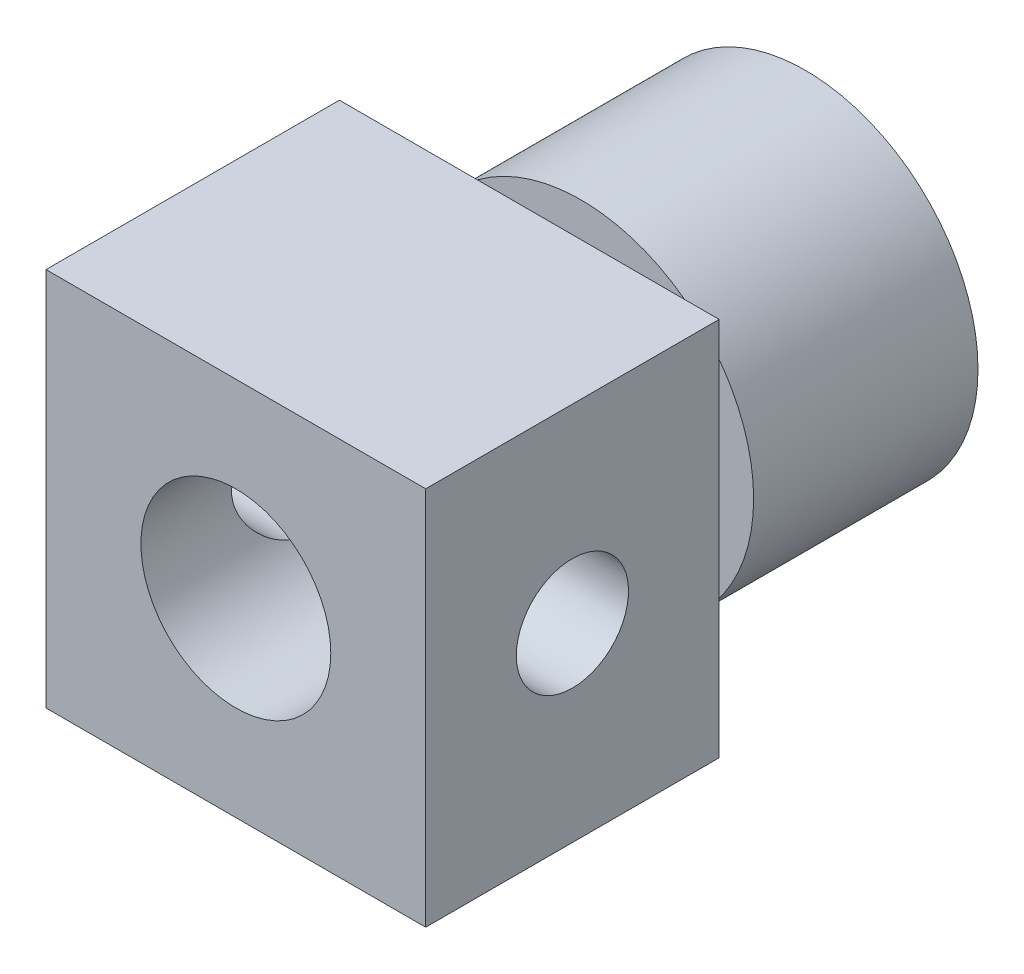
ISO-10303-21;
HEADER;
FILE_DESCRIPTION(('STEP AP214'),'2;1');
FILE_NAME('part.step','',(''),(''),'','','');
FILE_SCHEMA(('AUTOMOTIVE_DESIGN { 1 0 10303 214 1 1 1 1 }'));
ENDSEC;
DATA;
#1=APPLICATION_CONTEXT('core data for automotive mechanical design processes');
#2=APPLICATION_PROTOCOL_DEFINITION('international standard','automotive_design',2000,#1);
#3=PRODUCT_CONTEXT('',#1,'mechanical');
#4=PRODUCT('Part','Part','',(#3));
#5=PRODUCT_RELATED_PRODUCT_CATEGORY('part','',(#4));
#6=PRODUCT_DEFINITION_FORMATION('','',#4);
#7=PRODUCT_DEFINITION_CONTEXT('part definition',#1,'design');
#8=PRODUCT_DEFINITION('design','',#6,#7);
#9=PRODUCT_DEFINITION_SHAPE('','',#8);
#10=(LENGTH_UNIT() NAMED_UNIT(*) SI_UNIT(.MILLI.,.METRE.));
#11=(NAMED_UNIT(*) PLANE_ANGLE_UNIT() SI_UNIT($,.RADIAN.));
#12=(NAMED_UNIT(*) SI_UNIT($,.STERADIAN.) SOLID_ANGLE_UNIT());
#13=UNCERTAINTY_MEASURE_WITH_UNIT(LENGTH_MEASURE(1.E-05),#10,'distance_accuracy_value','');
#14=(GEOMETRIC_REPRESENTATION_CONTEXT(3) GLOBAL_UNCERTAINTY_ASSIGNED_CONTEXT((#13)) GLOBAL_UNIT_ASSIGNED_CONTEXT((#10,
#11,#12)) REPRESENTATION_CONTEXT('',''));
#15=CARTESIAN_POINT('',(0.,0.,0.));
#16=DIRECTION('',(0.,0.,1.));
#17=DIRECTION('',(1.,0.,0.));
#18=AXIS2_PLACEMENT_3D('',#15,#16,#17);
#19=CARTESIAN_POINT('',(11.,-11.,17.));
#20=DIRECTION('',(-1.,0.,0.));
#21=DIRECTION('',(0.,-1.,0.));
#22=AXIS2_PLACEMENT_3D('',#19,#20,#21);
#23=PLANE('',#22);
#24=CARTESIAN_POINT('',(11.,0.,8.5));
#25=DIRECTION('',(-1.,0.,0.));
#26=DIRECTION('',(0.,-1.,0.));
#27=AXIS2_PLACEMENT_3D('',#24,#25,#26);
#28=CIRCLE('',#27,3.25);
#29=CARTESIAN_POINT('',(11.,-3.24999999999999,8.5));
#30=VERTEX_POINT('',#29);
#31=EDGE_CURVE('E138',#30,#30,#28,.T.);
#32=ORIENTED_EDGE('',*,*,#31,.T.);
#33=EDGE_LOOP('',(#32));
#34=FACE_BOUND('',#33,.T.);
#35=DIRECTION('',(0.,1.,0.));
#36=VECTOR('',#35,1.);
#37=CARTESIAN_POINT('',(11.,-11.,0.));
#38=LINE('',#37,#36);
#39=CARTESIAN_POINT('',(11.,-11.,0.));
#40=VERTEX_POINT('',#39);
#41=CARTESIAN_POINT('',(11.,11.,0.));
#42=VERTEX_POINT('',#41);
#43=EDGE_CURVE('E103',#40,#42,#38,.T.);
#44=ORIENTED_EDGE('',*,*,#43,.T.);
#45=DIRECTION('',(0.,0.,-1.));
#46=VECTOR('',#45,1.);
#47=CARTESIAN_POINT('',(11.,11.,17.));
#48=LINE('',#47,#46);
#49=CARTESIAN_POINT('',(11.,11.,17.));
#50=VERTEX_POINT('',#49);
#51=EDGE_CURVE('E11',#50,#42,#48,.T.);
#52=ORIENTED_EDGE('',*,*,#51,.F.);
#53=DIRECTION('',(0.,1.,0.));
#54=VECTOR('',#53,1.);
#55=CARTESIAN_POINT('',(11.,-11.,17.));
#56=LINE('',#55,#54);
#57=CARTESIAN_POINT('',(11.,-11.,17.));
#58=VERTEX_POINT('',#57);
#59=EDGE_CURVE('E90',#58,#50,#56,.T.);
#60=ORIENTED_EDGE('',*,*,#59,.F.);
#61=DIRECTION('',(0.,0.,-1.));
#62=VECTOR('',#61,1.);
#63=CARTESIAN_POINT('',(11.,-11.,17.));
#64=LINE('',#63,#62);
#65=EDGE_CURVE('E99',#58,#40,#64,.T.);
#66=ORIENTED_EDGE('',*,*,#65,.T.);
#67=EDGE_LOOP('',(#44,#52,#60,#66));
#68=FACE_BOUND('',#67,.T.);
#69=ADVANCED_FACE('F33',(#34,#68),#23,.F.);
#70=CARTESIAN_POINT('',(11.,11.,17.));
#71=DIRECTION('',(0.,-1.,0.));
#72=DIRECTION('',(0.,0.,-1.));
#73=AXIS2_PLACEMENT_3D('',#70,#71,#72);
#74=PLANE('',#73);
#75=DIRECTION('',(-1.,0.,0.));
#76=VECTOR('',#75,1.);
#77=CARTESIAN_POINT('',(11.,11.,0.));
#78=LINE('',#77,#76);
#79=CARTESIAN_POINT('',(-11.,11.,0.));
#80=VERTEX_POINT('',#79);
#81=EDGE_CURVE('E94',#42,#80,#78,.T.);
#82=ORIENTED_EDGE('',*,*,#81,.T.);
#83=DIRECTION('',(0.,0.,-1.));
#84=VECTOR('',#83,1.);
#85=CARTESIAN_POINT('',(-11.,11.,17.));
#86=LINE('',#85,#84);
#87=CARTESIAN_POINT('',(-11.,11.,17.));
#88=VERTEX_POINT('',#87);
#89=EDGE_CURVE('E46',#88,#80,#86,.T.);
#90=ORIENTED_EDGE('',*,*,#89,.F.);
#91=DIRECTION('',(-1.,0.,0.));
#92=VECTOR('',#91,1.);
#93=CARTESIAN_POINT('',(11.,11.,17.));
#94=LINE('',#93,#92);
#95=EDGE_CURVE('E85',#50,#88,#94,.T.);
#96=ORIENTED_EDGE('',*,*,#95,.F.);
#97=ORIENTED_EDGE('',*,*,#51,.T.);
#98=EDGE_LOOP('',(#82,#90,#96,#97));
#99=FACE_BOUND('',#98,.T.);
#100=ADVANCED_FACE('F93',(#99),#74,.F.);
#101=CARTESIAN_POINT('',(-11.,11.,17.));
#102=DIRECTION('',(1.,0.,0.));
#103=DIRECTION('',(0.,1.,0.));
#104=AXIS2_PLACEMENT_3D('',#101,#102,#103);
#105=PLANE('',#104);
#106=CARTESIAN_POINT('',(-11.,0.,8.5));
#107=DIRECTION('',(1.,0.,0.));
#108=DIRECTION('',(0.,1.,0.));
#109=AXIS2_PLACEMENT_3D('',#106,#107,#108);
#110=CIRCLE('',#109,3.25);
#111=CARTESIAN_POINT('',(-11.,3.24999999999999,8.5));
#112=VERTEX_POINT('',#111);
#113=EDGE_CURVE('E166',#112,#112,#110,.T.);
#114=ORIENTED_EDGE('',*,*,#113,.T.);
#115=EDGE_LOOP('',(#114));
#116=FACE_BOUND('',#115,.T.);
#117=DIRECTION('',(0.,-1.,0.));
#118=VECTOR('',#117,1.);
#119=CARTESIAN_POINT('',(-11.,11.,0.));
#120=LINE('',#119,#118);
#121=CARTESIAN_POINT('',(-11.,-11.,0.));
#122=VERTEX_POINT('',#121);
#123=EDGE_CURVE('E72',#80,#122,#120,.T.);
#124=ORIENTED_EDGE('',*,*,#123,.T.);
#125=DIRECTION('',(0.,0.,-1.));
#126=VECTOR('',#125,1.);
#127=CARTESIAN_POINT('',(-11.,-11.,17.));
#128=LINE('',#127,#126);
#129=CARTESIAN_POINT('',(-11.,-11.,17.));
#130=VERTEX_POINT('',#129);
#131=EDGE_CURVE('E95',#130,#122,#128,.T.);
#132=ORIENTED_EDGE('',*,*,#131,.F.);
#133=DIRECTION('',(0.,-1.,0.));
#134=VECTOR('',#133,1.);
#135=CARTESIAN_POINT('',(-11.,11.,17.));
#136=LINE('',#135,#134);
#137=EDGE_CURVE('E88',#88,#130,#136,.T.);
#138=ORIENTED_EDGE('',*,*,#137,.F.);
#139=ORIENTED_EDGE('',*,*,#89,.T.);
#140=EDGE_LOOP('',(#124,#132,#138,#139));
#141=FACE_BOUND('',#140,.T.);
#142=ADVANCED_FACE('F97',(#116,#141),#105,.F.);
#143=CARTESIAN_POINT('',(-11.,-11.,17.));
#144=DIRECTION('',(0.,1.,0.));
#145=DIRECTION('',(0.,0.,1.));
#146=AXIS2_PLACEMENT_3D('',#143,#144,#145);
#147=PLANE('',#146);
#148=DIRECTION('',(1.,0.,0.));
#149=VECTOR('',#148,1.);
#150=CARTESIAN_POINT('',(-11.,-11.,0.));
#151=LINE('',#150,#149);
#152=EDGE_CURVE('E78',#122,#40,#151,.T.);
#153=ORIENTED_EDGE('',*,*,#152,.T.);
#154=ORIENTED_EDGE('',*,*,#65,.F.);
#155=DIRECTION('',(1.,0.,0.));
#156=VECTOR('',#155,1.);
#157=CARTESIAN_POINT('',(-11.,-11.,17.));
#158=LINE('',#157,#156);
#159=EDGE_CURVE('E55',#130,#58,#158,.T.);
#160=ORIENTED_EDGE('',*,*,#159,.F.);
#161=ORIENTED_EDGE('',*,*,#131,.T.);
#162=EDGE_LOOP('',(#153,#154,#160,#161));
#163=FACE_BOUND('',#162,.T.);
#164=ADVANCED_FACE('F153',(#163),#147,.F.);
#165=CARTESIAN_POINT('',(0.,0.,17.));
#166=DIRECTION('',(0.,0.,1.));
#167=DIRECTION('',(1.,0.,0.));
#168=AXIS2_PLACEMENT_3D('',#165,#166,#167);
#169=PLANE('',#168);
#170=CARTESIAN_POINT('',(0.,0.,17.));
#171=DIRECTION('',(0.,0.,1.));
#172=DIRECTION('',(1.,0.,0.));
#173=AXIS2_PLACEMENT_3D('',#170,#171,#172);
#174=CIRCLE('',#173,5.5);
#175=CARTESIAN_POINT('',(5.5,0.,17.));
#176=VERTEX_POINT('',#175);
#177=EDGE_CURVE('E169',#176,#176,#174,.T.);
#178=ORIENTED_EDGE('',*,*,#177,.F.);
#179=EDGE_LOOP('',(#178));
#180=FACE_BOUND('',#179,.T.);
#181=ORIENTED_EDGE('',*,*,#59,.T.);
#182=ORIENTED_EDGE('',*,*,#95,.T.);
#183=ORIENTED_EDGE('',*,*,#137,.T.);
#184=ORIENTED_EDGE('',*,*,#159,.T.);
#185=EDGE_LOOP('',(#181,#182,#183,#184));
#186=FACE_BOUND('',#185,.T.);
#187=ADVANCED_FACE('F86',(#180,#186),#169,.T.);
#188=CARTESIAN_POINT('',(0.,0.,0.));
#189=DIRECTION('',(0.,0.,1.));
#190=DIRECTION('',(1.,0.,0.));
#191=AXIS2_PLACEMENT_3D('',#188,#189,#190);
#192=PLANE('',#191);
#193=CARTESIAN_POINT('',(0.,0.,0.));
#194=DIRECTION('',(0.,0.,1.));
#195=DIRECTION('',(1.,0.,0.));
#196=AXIS2_PLACEMENT_3D('',#193,#194,#195);
#197=CIRCLE('',#196,7.);
#198=CARTESIAN_POINT('',(7.,0.,0.));
#199=VERTEX_POINT('',#198);
#200=EDGE_CURVE('E106',#199,#199,#197,.T.);
#201=ORIENTED_EDGE('',*,*,#200,.T.);
#202=EDGE_LOOP('',(#201));
#203=FACE_BOUND('',#202,.T.);
#204=ORIENTED_EDGE('',*,*,#43,.F.);
#205=ORIENTED_EDGE('',*,*,#152,.F.);
#206=ORIENTED_EDGE('',*,*,#123,.F.);
#207=ORIENTED_EDGE('',*,*,#81,.F.);
#208=EDGE_LOOP('',(#204,#205,#206,#207));
#209=FACE_BOUND('',#208,.T.);
#210=ADVANCED_FACE('F141',(#203,#209),#192,.F.);
#211=CARTESIAN_POINT('',(0.,0.,-3.));
#212=DIRECTION('',(0.,0.,1.));
#213=DIRECTION('',(1.,0.,0.));
#214=AXIS2_PLACEMENT_3D('',#211,#212,#213);
#215=CYLINDRICAL_SURFACE('',#214,7.);
#216=CARTESIAN_POINT('',(0.,0.,-3.));
#217=DIRECTION('',(0.,0.,-1.));
#218=DIRECTION('',(-1.,0.,0.));
#219=AXIS2_PLACEMENT_3D('',#216,#217,#218);
#220=CIRCLE('',#219,7.);
#221=CARTESIAN_POINT('',(-7.,0.,-3.));
#222=VERTEX_POINT('',#221);
#223=EDGE_CURVE('E182',#222,#222,#220,.F.);
#224=ORIENTED_EDGE('',*,*,#223,.T.);
#225=EDGE_LOOP('',(#224));
#226=FACE_BOUND('',#225,.T.);
#227=ORIENTED_EDGE('',*,*,#200,.F.);
#228=EDGE_LOOP('',(#227));
#229=FACE_BOUND('',#228,.T.);
#230=ADVANCED_FACE('F143',(#226,#229),#215,.T.);
#231=CARTESIAN_POINT('',(0.,0.,-16.));
#232=DIRECTION('',(0.,0.,1.));
#233=DIRECTION('',(1.,0.,0.));
#234=AXIS2_PLACEMENT_3D('',#231,#232,#233);
#235=CYLINDRICAL_SURFACE('',#234,10.);
#236=CARTESIAN_POINT('',(0.,0.,-16.));
#237=DIRECTION('',(0.,0.,-1.));
#238=DIRECTION('',(-1.,0.,0.));
#239=AXIS2_PLACEMENT_3D('',#236,#237,#238);
#240=CIRCLE('',#239,10.);
#241=CARTESIAN_POINT('',(-10.,0.,-16.));
#242=VERTEX_POINT('',#241);
#243=EDGE_CURVE('E179',#242,#242,#240,.T.);
#244=ORIENTED_EDGE('',*,*,#243,.F.);
#245=EDGE_LOOP('',(#244));
#246=FACE_BOUND('',#245,.T.);
#247=CARTESIAN_POINT('',(0.,0.,-3.));
#248=DIRECTION('',(0.,0.,-1.));
#249=DIRECTION('',(-1.,0.,0.));
#250=AXIS2_PLACEMENT_3D('',#247,#248,#249);
#251=CIRCLE('',#250,10.);
#252=CARTESIAN_POINT('',(-10.,0.,-3.));
#253=VERTEX_POINT('',#252);
#254=EDGE_CURVE('E176',#253,#253,#251,.T.);
#255=ORIENTED_EDGE('',*,*,#254,.T.);
#256=EDGE_LOOP('',(#255));
#257=FACE_BOUND('',#256,.T.);
#258=ADVANCED_FACE('F150',(#246,#257),#235,.T.);
#259=CARTESIAN_POINT('',(0.,0.,-16.));
#260=DIRECTION('',(0.,0.,-1.));
#261=DIRECTION('',(-1.,0.,0.));
#262=AXIS2_PLACEMENT_3D('',#259,#260,#261);
#263=PLANE('',#262);
#264=CARTESIAN_POINT('',(0.,0.,-16.));
#265=DIRECTION('',(0.,0.,1.));
#266=DIRECTION('',(1.,0.,0.));
#267=AXIS2_PLACEMENT_3D('',#264,#265,#266);
#268=CIRCLE('',#267,5.5);
#269=CARTESIAN_POINT('',(5.5,0.,-16.));
#270=VERTEX_POINT('',#269);
#271=EDGE_CURVE('E173',#270,#270,#268,.T.);
#272=ORIENTED_EDGE('',*,*,#271,.T.);
#273=EDGE_LOOP('',(#272));
#274=FACE_BOUND('',#273,.T.);
#275=ORIENTED_EDGE('',*,*,#243,.T.);
#276=EDGE_LOOP('',(#275));
#277=FACE_BOUND('',#276,.T.);
#278=ADVANCED_FACE('F194',(#274,#277),#263,.T.);
#279=CARTESIAN_POINT('',(0.,0.,-3.));
#280=DIRECTION('',(0.,0.,-1.));
#281=DIRECTION('',(-1.,0.,0.));
#282=AXIS2_PLACEMENT_3D('',#279,#280,#281);
#283=PLANE('',#282);
#284=ORIENTED_EDGE('',*,*,#223,.F.);
#285=EDGE_LOOP('',(#284));
#286=FACE_BOUND('',#285,.T.);
#287=ORIENTED_EDGE('',*,*,#254,.F.);
#288=EDGE_LOOP('',(#287));
#289=FACE_BOUND('',#288,.T.);
#290=ADVANCED_FACE('F191',(#286,#289),#283,.F.);
#291=CARTESIAN_POINT('',(0.,0.,-16.));
#292=DIRECTION('',(0.,0.,1.));
#293=DIRECTION('',(1.,0.,0.));
#294=AXIS2_PLACEMENT_3D('',#291,#292,#293);
#295=CYLINDRICAL_SURFACE('',#294,5.5);
#296=CARTESIAN_POINT('',(5.5,0.,5.25));
#297=CARTESIAN_POINT('',(5.49999936751364,0.0833686342938196,5.25000069268793));
#298=CARTESIAN_POINT('',(5.49809935675368,0.166764530401117,5.25321323537788));
#299=CARTESIAN_POINT('',(5.49054506200042,0.332929223961618,5.26602244546107));
#300=CARTESIAN_POINT('',(5.48488837986076,0.415697586657911,5.2756231908989));
#301=CARTESIAN_POINT('',(5.46994469255171,0.580109814449852,5.30110913319783));
#302=CARTESIAN_POINT('',(5.46065023793302,0.661751013880572,5.31700722661071));
#303=CARTESIAN_POINT('',(5.43866389500503,0.823156877609971,5.35487705347175));
#304=CARTESIAN_POINT('',(5.42597054685625,0.902920719523134,5.37685139682831));
#305=CARTESIAN_POINT('',(5.3833710030438,1.13773523003822,5.45125237797453));
#306=CARTESIAN_POINT('',(5.34884832870976,1.28931583074348,5.51231694742813));
#307=CARTESIAN_POINT('',(5.27045845654917,1.57953818311456,5.65504414670808));
#308=CARTESIAN_POINT('',(5.22659405658125,1.71818379098707,5.7367006105812));
#309=CARTESIAN_POINT('',(5.12935536766012,1.99051108578382,5.92516069094247));
#310=CARTESIAN_POINT('',(5.07551406364624,2.12303609188623,6.03339327745936));
#311=CARTESIAN_POINT('',(4.96540292609368,2.36917785466069,6.26873337696088));
#312=CARTESIAN_POINT('',(4.90913010095652,2.48277043275171,6.39586463951691));
#313=CARTESIAN_POINT('',(4.7926403408896,2.70142042801642,6.68309305169186));
#314=CARTESIAN_POINT('',(4.7327423848269,2.8038858502766,6.84531026600595));
#315=CARTESIAN_POINT('',(4.62408365644691,2.97969489737381,7.18817761572951));
#316=CARTESIAN_POINT('',(4.57530519254142,3.05308492168104,7.36879779915082));
#317=CARTESIAN_POINT('',(4.5064184380279,3.15356876068913,7.69999255557079));
#318=CARTESIAN_POINT('',(4.48226631543234,3.18748949165174,7.8476518373784));
#319=CARTESIAN_POINT('',(4.44852737890894,3.23442018582419,8.14782029758826));
#320=CARTESIAN_POINT('',(4.43892329152926,3.24745494882663,8.30032350449857));
#321=CARTESIAN_POINT('',(4.43568990651216,3.25187121614261,8.6060844008005));
#322=CARTESIAN_POINT('',(4.44208865440188,3.24321470569118,8.75934294432371));
#323=CARTESIAN_POINT('',(4.46994159025404,3.20470874888792,9.06180452814767));
#324=CARTESIAN_POINT('',(4.49140680288835,3.17484378336188,9.21100451556181));
#325=CARTESIAN_POINT('',(4.54619249815637,3.09586588891841,9.50019442927272));
#326=CARTESIAN_POINT('',(4.57939489484725,3.04694420426161,9.64026020447204));
#327=CARTESIAN_POINT('',(4.6540670056515,2.93161593618819,9.91058645286977));
#328=CARTESIAN_POINT('',(4.69553979231453,2.86520285155575,10.0408432570665));
#329=CARTESIAN_POINT('',(4.79062113030045,2.703725077057,10.3114172984147));
#330=CARTESIAN_POINT('',(4.84509367627549,2.60570735380561,10.449671339799));
#331=CARTESIAN_POINT('',(4.95520459229728,2.38970593906772,10.7091561556151));
#332=CARTESIAN_POINT('',(5.01084399859294,2.27170377988005,10.8303709926978));
#333=CARTESIAN_POINT('',(5.12563927121357,2.00053312291127,11.0684512874234));
#334=CARTESIAN_POINT('',(5.18430284108353,1.84478359428562,11.1826729314503));
#335=CARTESIAN_POINT('',(5.26407557825945,1.59598018005766,11.3328014838993));
#336=CARTESIAN_POINT('',(5.28930500704412,1.51047637122916,11.3793255750876));
#337=CARTESIAN_POINT('',(5.33632055782216,1.33488500897751,11.4648098303167));
#338=CARTESIAN_POINT('',(5.35810878700469,1.24480030565733,11.5037746265917));
#339=CARTESIAN_POINT('',(5.39629453569309,1.06665933501848,11.5713545559005));
#340=CARTESIAN_POINT('',(5.41295005681385,0.978850546261472,11.6004770901486));
#341=CARTESIAN_POINT('',(5.44218660725737,0.800477420065309,11.651242032989));
#342=CARTESIAN_POINT('',(5.45476988980315,0.709914636900127,11.6728885785909));
#343=CARTESIAN_POINT('',(5.47548444852861,0.526831146095766,11.7083699086131));
#344=CARTESIAN_POINT('',(5.4836187407859,0.434311809155629,11.722209985426));
#345=CARTESIAN_POINT('',(5.49519091217992,0.248138631917243,11.7418646889515));
#346=CARTESIAN_POINT('',(5.49862940597351,0.154484941719609,11.7476803660193));
#347=CARTESIAN_POINT('',(5.50056379065291,-0.0206896924269766,11.7509541921818));
#348=CARTESIAN_POINT('',(5.49965012866561,-0.102186751406797,11.74941071252));
#349=CARTESIAN_POINT('',(5.49422890837552,-0.26472431432713,11.740225354165));
#350=CARTESIAN_POINT('',(5.48972017617189,-0.345764660430795,11.732581483506));
#351=CARTESIAN_POINT('',(5.4709340736482,-0.587212891418644,11.7006178408866));
#352=CARTESIAN_POINT('',(5.4513984980022,-0.746132341740544,11.6672691775134));
#353=CARTESIAN_POINT('',(5.40059701951449,-1.05225557359989,11.5789943447032));
#354=CARTESIAN_POINT('',(5.36956755048644,-1.19962749810514,11.5245021010056));
#355=CARTESIAN_POINT('',(5.29826225414573,-1.48317090358691,11.3960209112318));
#356=CARTESIAN_POINT('',(5.25798448371472,-1.61934002261501,11.3220278674482));
#357=CARTESIAN_POINT('',(5.1665717581456,-1.89190341639757,11.1480204724214));
#358=CARTESIAN_POINT('',(5.11474286048029,-2.0268433006862,11.0460983256513));
#359=CARTESIAN_POINT('',(5.00760526535814,-2.27874243419957,10.8233915413074));
#360=CARTESIAN_POINT('',(4.9522925540085,-2.3956803879435,10.7025848994113));
#361=CARTESIAN_POINT('',(4.83602405259662,-2.62319164715281,10.4279554567196));
#362=CARTESIAN_POINT('',(4.77522298431949,-2.73116031709343,10.2718947046612));
#363=CARTESIAN_POINT('',(4.66258339987871,-2.91930962501001,9.94092176134086));
#364=CARTESIAN_POINT('',(4.61073454044588,-2.99952244085876,9.76603170987006));
#365=CARTESIAN_POINT('',(4.53351350848693,-3.11464115589425,9.44049394862891));
#366=CARTESIAN_POINT('',(4.50484109163145,-3.15559182958112,9.2927738513506));
#367=CARTESIAN_POINT('',(4.46167160721966,-3.21635056854442,8.99110707584244));
#368=CARTESIAN_POINT('',(4.44715597068691,-3.23618633267742,8.83716883067418));
#369=CARTESIAN_POINT('',(4.43442649297472,-3.25361282095894,8.5268464476966));
#370=CARTESIAN_POINT('',(4.43626401283575,-3.2511334587831,8.37045614482181));
#371=CARTESIAN_POINT('',(4.45607313483243,-3.22392175519534,8.06063260939229));
#372=CARTESIAN_POINT('',(4.47405418333932,-3.19917638482991,7.90720116191099));
#373=CARTESIAN_POINT('',(4.52256116904837,-3.13019310203328,7.6132338067638));
#374=CARTESIAN_POINT('',(4.55258937833032,-3.08672404464625,7.47242988186556));
#375=CARTESIAN_POINT('',(4.62172005259197,-2.98221708932646,7.19992033067805));
#376=CARTESIAN_POINT('',(4.66082592297552,-2.92117259605488,7.06821814294607));
#377=CARTESIAN_POINT('',(4.75106422467903,-2.77237395243953,6.7958571721929));
#378=CARTESIAN_POINT('',(4.80312127923156,-2.68194868322038,6.65696494511759));
#379=CARTESIAN_POINT('',(4.9096125507394,-2.48165486653074,6.39497243300527));
#380=CARTESIAN_POINT('',(4.96404865807285,-2.37177063748607,6.27188502380114));
#381=CARTESIAN_POINT('',(5.07886457762142,-2.11601882697373,6.02595152352066));
#382=CARTESIAN_POINT('',(5.13890491780294,-1.96722437659066,5.90593331132018));
#383=CARTESIAN_POINT('',(5.22206900587385,-1.72834160784627,5.7459925301392));
#384=CARTESIAN_POINT('',(5.24865975346579,-1.64602558070938,5.69599426539706));
#385=CARTESIAN_POINT('',(5.29882001144604,-1.47658080377645,5.60318742628785));
#386=CARTESIAN_POINT('',(5.32239125855567,-1.38945486213459,5.5603747145818));
#387=CARTESIAN_POINT('',(5.36496376614874,-1.21447590212391,5.48399272502679));
#388=CARTESIAN_POINT('',(5.3841090665078,-1.1267883934213,5.4501244753273));
#389=CARTESIAN_POINT('',(5.41842079100955,-0.948145023926228,5.38995252828225));
#390=CARTESIAN_POINT('',(5.43358953405603,-0.857191103265464,5.36364442142323));
#391=CARTESIAN_POINT('',(5.45945764263522,-0.67301256714549,5.31903994639647));
#392=CARTESIAN_POINT('',(5.47017031080937,-0.57979560231977,5.30071972412843));
#393=CARTESIAN_POINT('',(5.48684100659077,-0.391751109078143,5.27229832420903));
#394=CARTESIAN_POINT('',(5.49280315257229,-0.296925048645321,5.2621900272369));
#395=CARTESIAN_POINT('',(5.49753007162861,-0.168214593540196,5.25418141594147));
#396=CARTESIAN_POINT('',(5.49845570735289,-0.134599519629898,5.25261401089437));
#397=CARTESIAN_POINT('',(5.49969080522127,-0.0673244461229646,5.25052315293251));
#398=CARTESIAN_POINT('',(5.50000025539944,-0.0336644456665861,5.24999972029103));
#399=CARTESIAN_POINT('',(5.5,0.,5.25));
#400=B_SPLINE_CURVE_WITH_KNOTS('',3,(#296,#297,#298,#299,#300,#301,#302,#303,#304,#305,#306,
#307,#308,#309,#310,#311,#312,#313,#314,#315,#316,#317,#318,#319,#320,#321,#322,#323,#324,#325,
#326,#327,#328,#329,#330,#331,#332,#333,#334,#335,#336,#337,#338,#339,#340,#341,#342,#343,#344,
#345,#346,#347,#348,#349,#350,#351,#352,#353,#354,#355,#356,#357,#358,#359,#360,#361,#362,#363,
#364,#365,#366,#367,#368,#369,#370,#371,#372,#373,#374,#375,#376,#377,#378,#379,#380,#381,#382,
#383,#384,#385,#386,#387,#388,#389,#390,#391,#392,#393,#394,#395,#396,#397,#398,#399),
.UNSPECIFIED.,.T.,.F.,(4,2,2,2,2,2,2,2,2,2,2,2,2,2,2,2,2,2,2,2,2,2,2,2,2,2,2,2,2,2,2,2,2,2,2,2,
2,2,2,2,2,2,2,2,2,2,2,2,2,2,2,4),(0.,0.2500697705534,0.500299331796072,0.751044018275922,
1.00189657390926,1.50056846850607,1.99909121975245,2.53509028027298,3.07176870472921,
3.67182350067391,4.27091681464016,4.72920943749464,5.18695748386978,5.64550831162603,
6.10439502772023,6.5587905312253,7.01335516369941,7.54531582525216,8.07777078339378,
8.67988699924906,8.98120077395418,9.28232932034812,9.56392439860218,9.84536339914566,
10.1266113681812,10.4078225197157,10.6520575983989,10.8963724600106,11.3844563956151,
11.8630123788593,12.3416690014685,12.8701910407153,13.3993335715036,13.9943494154759,
14.5886731171539,15.0545732449924,15.5198614419859,15.9866115035,16.4536348615261,
16.9030773331062,17.3526886822925,17.8718581969698,18.3914480195975,18.9892862539487,
19.2886921582344,19.5879250730112,19.8753048336053,20.1625166358771,20.448864767345,
20.7349643838569,20.8359411696526,20.9369199163355),.UNSPECIFIED.);
#401=CARTESIAN_POINT('',(5.5,0.,5.25));
#402=VERTEX_POINT('',#401);
#403=EDGE_CURVE('E36',#402,#402,#400,.T.);
#404=ORIENTED_EDGE('',*,*,#403,.T.);
#405=EDGE_LOOP('',(#404));
#406=FACE_BOUND('',#405,.T.);
#407=CARTESIAN_POINT('',(-4.43705983732471,3.25,8.5));
#408=CARTESIAN_POINT('',(-4.43705951276402,3.25000022955312,8.41795178046031));
#409=CARTESIAN_POINT('',(-4.43934407802691,3.24688827051935,8.33590618421117));
#410=CARTESIAN_POINT('',(-4.44838139929495,3.23449552058568,8.17250033109482));
#411=CARTESIAN_POINT('',(-4.45513597825819,3.22521221288336,8.09114036755703));
#412=CARTESIAN_POINT('',(-4.47283302991402,3.20062387187558,7.9297627975633));
#413=CARTESIAN_POINT('',(-4.48377741729492,3.18531608537139,7.84974582231254));
#414=CARTESIAN_POINT('',(-4.50941754989851,3.14891190887862,7.69163986046034));
#415=CARTESIAN_POINT('',(-4.52411505755057,3.12781279899045,7.61355179860432));
#416=CARTESIAN_POINT('',(-4.57281516494036,3.05657743829143,7.38405975560407));
#417=CARTESIAN_POINT('',(-4.6115842784031,2.99829635413462,7.23611167539763));
#418=CARTESIAN_POINT('',(-4.6972922572564,2.86214881928078,6.95227270054472));
#419=CARTESIAN_POINT('',(-4.74423368244793,2.78427622855365,6.81638560393766));
#420=CARTESIAN_POINT('',(-4.84771826906928,2.60038632079743,6.54277098264618));
#421=CARTESIAN_POINT('',(-4.90474054515377,2.49213039982063,6.40672403859048));
#422=CARTESIAN_POINT('',(-5.01811054767427,2.25518739651808,6.15334647754925));
#423=CARTESIAN_POINT('',(-5.07445776157382,2.12648573223566,6.03602933935379));
#424=CARTESIAN_POINT('',(-5.18709391286144,1.83593375132512,5.81134639980902));
#425=CARTESIAN_POINT('',(-5.24277120473427,1.67203012330252,5.70627315689025));
#426=CARTESIAN_POINT('',(-5.31643411231101,1.41198810485743,5.57111414552596));
#427=CARTESIAN_POINT('',(-5.33935185259943,1.32291300535626,5.5297935683961));
#428=CARTESIAN_POINT('',(-5.38123888713622,1.14060769202614,5.45513654012449));
#429=CARTESIAN_POINT('',(-5.40021075007779,1.04738022961129,5.42179489270429));
#430=CARTESIAN_POINT('',(-5.43204570201205,0.866333067335769,5.36629837997491));
#431=CARTESIAN_POINT('',(-5.44531209886845,0.778813451753516,5.34339290771491));
#432=CARTESIAN_POINT('',(-5.46771563421543,0.601703010323995,5.30490068357859));
#433=CARTESIAN_POINT('',(-5.47685504497669,0.512113352852017,5.2893099041324));
#434=CARTESIAN_POINT('',(-5.49073695400609,0.331643581875883,5.26568627540376));
#435=CARTESIAN_POINT('',(-5.49548168052245,0.240764146090928,5.25764959591564));
#436=CARTESIAN_POINT('',(-5.50044509972081,0.0585588227024859,5.24924592644157));
#437=CARTESIAN_POINT('',(-5.50066423256242,-0.0327670206191712,5.24887819057352));
#438=CARTESIAN_POINT('',(-5.49498196680308,-0.284150008393482,5.25848959924814));
#439=CARTESIAN_POINT('',(-5.48432022026186,-0.443886051672873,5.27651465146694));
#440=CARTESIAN_POINT('',(-5.44987927050037,-0.757480465764448,5.33547169008644));
#441=CARTESIAN_POINT('',(-5.42609909771372,-0.911338401234247,5.37640536963823));
#442=CARTESIAN_POINT('',(-5.36730180884243,-1.2105706395627,5.47969495712759));
#443=CARTESIAN_POINT('',(-5.33220879992122,-1.35587957557995,5.54219575468429));
#444=CARTESIAN_POINT('',(-5.25362072049884,-1.63413938560905,5.6863411179885));
#445=CARTESIAN_POINT('',(-5.21012337223435,-1.76708689489713,5.76799087481644));
#446=CARTESIAN_POINT('',(-5.11242732162321,-2.03359625551384,5.95895124201982));
#447=CARTESIAN_POINT('',(-5.05757175315796,-2.16539527797152,6.07038458945672));
#448=CARTESIAN_POINT('',(-4.94592776554678,-2.4095361396666,6.31225657370064));
#449=CARTESIAN_POINT('',(-4.88913688868377,-2.52185204434692,6.4427201235728));
#450=CARTESIAN_POINT('',(-4.77270972814798,-2.73636801581351,6.73609062726522));
#451=CARTESIAN_POINT('',(-4.71345378667966,-2.83607409532514,6.90099007623435));
#452=CARTESIAN_POINT('',(-4.60710725075711,-3.00576993585067,7.24894696704543));
#453=CARTESIAN_POINT('',(-4.55999449330654,-3.07581398665836,7.43197047229089));
#454=CARTESIAN_POINT('',(-4.49521848265611,-3.16945279644834,7.76555743452374));
#455=CARTESIAN_POINT('',(-4.47318900142133,-3.20018350585527,7.91326977000761));
#456=CARTESIAN_POINT('',(-4.44384880856796,-3.24081304908999,8.21290902328745));
#457=CARTESIAN_POINT('',(-4.43652198631522,-3.25073468527592,8.36483114281952));
#458=CARTESIAN_POINT('',(-4.43766090078673,-3.24917901268613,8.66866457518797));
#459=CARTESIAN_POINT('',(-4.44614412175242,-3.23767801274039,8.82057569004442));
#460=CARTESIAN_POINT('',(-4.47766766001535,-3.19393012500205,9.11985868612078));
#461=CARTESIAN_POINT('',(-4.50071921753569,-3.16166721797616,9.26722697015222));
#462=CARTESIAN_POINT('',(-4.55844732576407,-3.07784408843156,9.55444783938109));
#463=CARTESIAN_POINT('',(-4.59316477318212,-3.02621590264188,9.69427194752028));
#464=CARTESIAN_POINT('',(-4.67048125985736,-2.90546701171963,9.96376075118418));
#465=CARTESIAN_POINT('',(-4.71308334695009,-2.83633953836169,10.0934214903375));
#466=CARTESIAN_POINT('',(-4.81041473767607,-2.66849663081054,10.3630848964196));
#467=CARTESIAN_POINT('',(-4.86595866056383,-2.56671477283072,10.5008897899071));
#468=CARTESIAN_POINT('',(-4.97758210795131,-2.3429395194254,10.7588396420777));
#469=CARTESIAN_POINT('',(-5.03366207965298,-2.22092754801112,10.8789681765752));
#470=CARTESIAN_POINT('',(-5.14801836446282,-1.94244222750075,11.1127000995128));
#471=CARTESIAN_POINT('',(-5.20575163188491,-1.78359092098176,11.2237935862421));
#472=CARTESIAN_POINT('',(-5.28352030876592,-1.53044652337076,11.36874958864));
#473=CARTESIAN_POINT('',(-5.30797876216941,-1.44355215910107,11.413466777058));
#474=CARTESIAN_POINT('',(-5.35326043475096,-1.26531823591987,11.4951727622409));
#475=CARTESIAN_POINT('',(-5.37408593640282,-1.17398151447622,11.532166414367));
#476=CARTESIAN_POINT('',(-5.41003846524386,-0.994592112271893,11.5954223124506));
#477=CARTESIAN_POINT('',(-5.42547720383962,-0.906812899575491,11.6222842836));
#478=CARTESIAN_POINT('',(-5.45224959921051,-0.728748044919308,11.6685773744893));
#479=CARTESIAN_POINT('',(-5.46358552693379,-0.638463819399241,11.6880126053401));
#480=CARTESIAN_POINT('',(-5.48181357732667,-0.456176981373914,11.7191522539236));
#481=CARTESIAN_POINT('',(-5.48870844030738,-0.364175464639774,11.7308614390385));
#482=CARTESIAN_POINT('',(-5.49785705289155,-0.179312031703559,11.7463772733893));
#483=CARTESIAN_POINT('',(-5.50011135506879,-0.0864502192639142,11.7501848635064));
#484=CARTESIAN_POINT('',(-5.49979564751372,0.168283260323037,11.7496604154037));
#485=CARTESIAN_POINT('',(-5.49240443951672,0.330230321601952,11.737191739939));
#486=CARTESIAN_POINT('',(-5.46390791192732,0.649167280604539,11.6885985103351));
#487=CARTESIAN_POINT('',(-5.44280222977344,0.80615704716007,11.6524733308026));
#488=CARTESIAN_POINT('',(-5.38907371179135,1.10968893146828,11.5587694302376));
#489=CARTESIAN_POINT('',(-5.35656778015217,1.25631959524517,11.5014081551923));
#490=CARTESIAN_POINT('',(-5.28260862300614,1.53794694200191,11.3673288924097));
#491=CARTESIAN_POINT('',(-5.24115327097065,1.67294084921165,11.2906063033742));
#492=CARTESIAN_POINT('',(-5.1474213289072,1.94337445741789,11.1105555279485));
#493=CARTESIAN_POINT('',(-5.09445701093402,2.07724665599699,11.0052347247219));
#494=CARTESIAN_POINT('',(-4.9855821096094,2.32648033688471,10.775684501245));
#495=CARTESIAN_POINT('',(-4.92966817894516,2.44182016053285,10.6514332826784));
#496=CARTESIAN_POINT('',(-4.81313009418416,2.66484986773158,10.3700517974535));
#497=CARTESIAN_POINT('',(-4.7527461070914,2.7699599189768,10.2107651807668));
#498=CARTESIAN_POINT('',(-4.64203004709282,2.9517689195206,9.87335858218073));
#499=CARTESIAN_POINT('',(-4.59168867298834,3.02849421483829,9.69525626297923));
#500=CARTESIAN_POINT('',(-4.53273428921707,3.11533599745025,9.4297048826095));
#501=CARTESIAN_POINT('',(-4.51663473700694,3.1385676229671,9.3480352989688));
#502=CARTESIAN_POINT('',(-4.48850174583333,3.17867203727288,9.18248196395193));
#503=CARTESIAN_POINT('',(-4.47646592292674,3.19554855488991,9.09859954196391));
#504=CARTESIAN_POINT('',(-4.45699196442571,3.22265447809521,8.92934492751922));
#505=CARTESIAN_POINT('',(-4.44954824212152,3.232891961455,8.84397467574383));
#506=CARTESIAN_POINT('',(-4.43958247085784,3.24656443348345,8.6724019565572));
#507=CARTESIAN_POINT('',(-4.43706017830687,3.2499997588324,8.58619953054759));
#508=CARTESIAN_POINT('',(-4.43705983732471,3.25,8.5));
#509=B_SPLINE_CURVE_WITH_KNOTS('',3,(#407,#408,#409,#410,#411,#412,#413,#414,#415,#416,#417,
#418,#419,#420,#421,#422,#423,#424,#425,#426,#427,#428,#429,#430,#431,#432,#433,#434,#435,#436,
#437,#438,#439,#440,#441,#442,#443,#444,#445,#446,#447,#448,#449,#450,#451,#452,#453,#454,#455,
#456,#457,#458,#459,#460,#461,#462,#463,#464,#465,#466,#467,#468,#469,#470,#471,#472,#473,#474,
#475,#476,#477,#478,#479,#480,#481,#482,#483,#484,#485,#486,#487,#488,#489,#490,#491,#492,#493,
#494,#495,#496,#497,#498,#499,#500,#501,#502,#503,#504,#505,#506,#507,#508),.UNSPECIFIED.,.T.,
.F.,(4,2,2,2,2,2,2,2,2,2,2,2,2,2,2,2,2,2,2,2,2,2,2,2,2,2,2,2,2,2,2,2,2,2,2,2,2,2,2,2,2,2,2,2,2,
2,2,2,2,2,4),(0.,0.246050258474548,0.492200922893511,0.738464209523188,0.984843352382042,
1.47362747124854,1.96256496759709,2.50928854643033,3.05640381509648,3.66023917883566,
3.96234537090208,4.26425427758137,4.53816979204013,4.81193430735303,5.08555993902161,
5.35915895771358,5.83993738572763,6.32075135223225,6.80486046318415,7.28910096300591,
7.83023193464784,8.37207778465731,8.97387173086461,9.57455941511174,10.0300106563864,
10.4849625577892,10.9404178866199,11.396225052456,11.8536470922518,12.3112463208777,
12.8494035146268,13.3880576277101,13.9913050231357,14.2931527256249,14.5948100979286,
14.8736702192064,15.1523757516174,15.4309091466231,15.7094093734058,16.1945711268539,
16.6797457067599,17.1600838990507,17.6405363534264,18.1735604884553,18.7072031039842,
19.3048971208963,19.9020349730146,20.1610148885131,20.4198426111782,20.6783548220738,
20.9368542373031),.UNSPECIFIED.);
#510=CARTESIAN_POINT('',(-4.43705983732471,3.25,8.5));
#511=VERTEX_POINT('',#510);
#512=EDGE_CURVE('E111',#511,#511,#509,.T.);
#513=ORIENTED_EDGE('',*,*,#512,.T.);
#514=EDGE_LOOP('',(#513));
#515=FACE_BOUND('',#514,.T.);
#516=ORIENTED_EDGE('',*,*,#271,.F.);
#517=EDGE_LOOP('',(#516));
#518=FACE_BOUND('',#517,.T.);
#519=ORIENTED_EDGE('',*,*,#177,.T.);
#520=EDGE_LOOP('',(#519));
#521=FACE_BOUND('',#520,.T.);
#522=ADVANCED_FACE('F115',(#406,#515,#518,#521),#295,.F.);
#523=CARTESIAN_POINT('',(-35.5,0.,8.5));
#524=DIRECTION('',(1.,0.,0.));
#525=DIRECTION('',(0.,1.,0.));
#526=AXIS2_PLACEMENT_3D('',#523,#524,#525);
#527=CYLINDRICAL_SURFACE('',#526,3.25);
#528=ORIENTED_EDGE('',*,*,#512,.F.);
#529=EDGE_LOOP('',(#528));
#530=FACE_BOUND('',#529,.T.);
#531=ORIENTED_EDGE('',*,*,#113,.F.);
#532=EDGE_LOOP('',(#531));
#533=FACE_BOUND('',#532,.T.);
#534=ADVANCED_FACE('F121',(#530,#533),#527,.F.);
#535=ORIENTED_EDGE('',*,*,#403,.F.);
#536=EDGE_LOOP('',(#535));
#537=FACE_BOUND('',#536,.T.);
#538=ORIENTED_EDGE('',*,*,#31,.F.);
#539=EDGE_LOOP('',(#538));
#540=FACE_BOUND('',#539,.T.);
#541=ADVANCED_FACE('F118',(#537,#540),#527,.F.);
#542=CLOSED_SHELL('',(#69,#100,#142,#164,#187,#210,#230,#258,#278,#290,#522,#534,#541));
#543=MANIFOLD_SOLID_BREP('B2',#542);
#544=ADVANCED_BREP_SHAPE_REPRESENTATION('',(#18,#543),#14);
#545=SHAPE_DEFINITION_REPRESENTATION(#9,#544);
ENDSEC;
END-ISO-10303-21;
